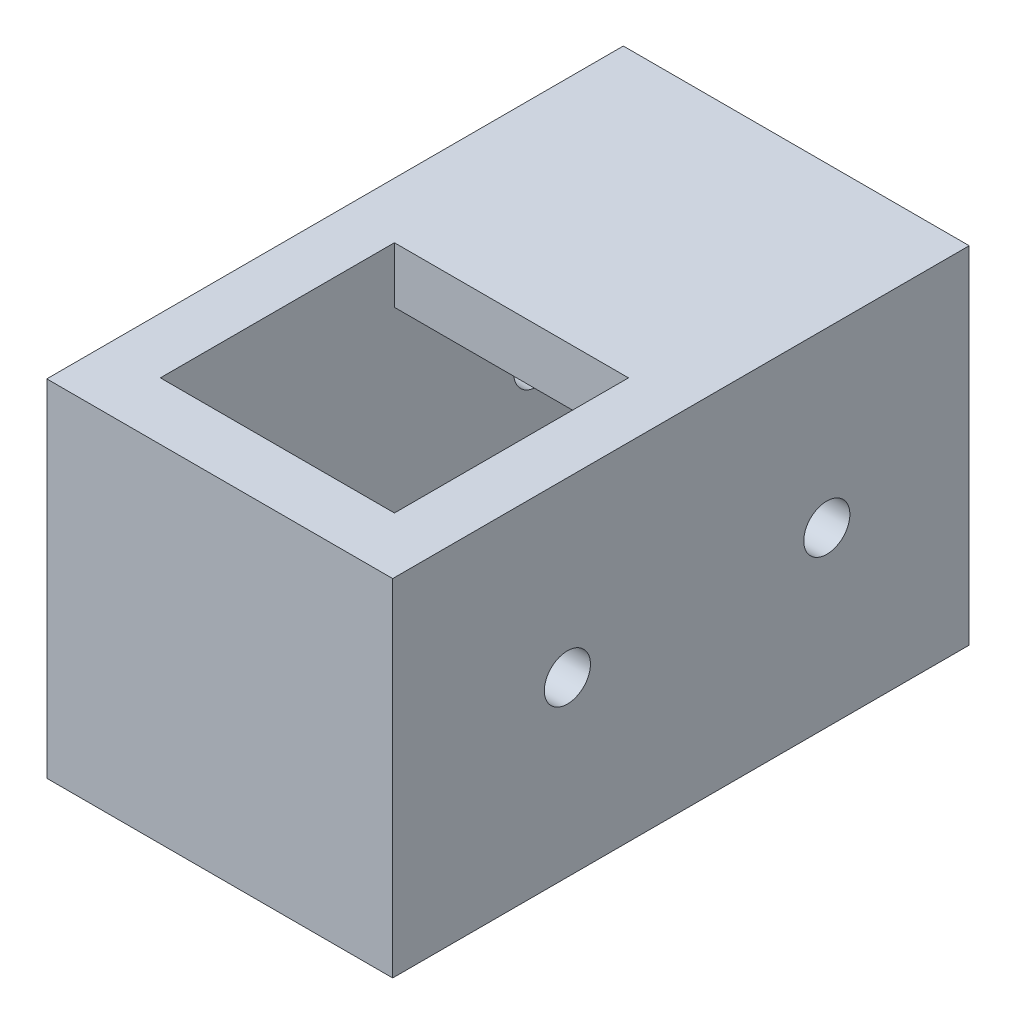
ISO-10303-21;
HEADER;
FILE_DESCRIPTION(('STEP AP214'),'2;1');
FILE_NAME('part.step','',(''),(''),'','','');
FILE_SCHEMA(('AUTOMOTIVE_DESIGN { 1 0 10303 214 1 1 1 1 }'));
ENDSEC;
DATA;
#1=APPLICATION_CONTEXT('core data for automotive mechanical design processes');
#2=APPLICATION_PROTOCOL_DEFINITION('international standard','automotive_design',2000,#1);
#3=PRODUCT_CONTEXT('',#1,'mechanical');
#4=PRODUCT('Part','Part','',(#3));
#5=PRODUCT_RELATED_PRODUCT_CATEGORY('part','',(#4));
#6=PRODUCT_DEFINITION_FORMATION('','',#4);
#7=PRODUCT_DEFINITION_CONTEXT('part definition',#1,'design');
#8=PRODUCT_DEFINITION('design','',#6,#7);
#9=PRODUCT_DEFINITION_SHAPE('','',#8);
#10=(LENGTH_UNIT() NAMED_UNIT(*) SI_UNIT(.MILLI.,.METRE.));
#11=(NAMED_UNIT(*) PLANE_ANGLE_UNIT() SI_UNIT($,.RADIAN.));
#12=(NAMED_UNIT(*) SI_UNIT($,.STERADIAN.) SOLID_ANGLE_UNIT());
#13=UNCERTAINTY_MEASURE_WITH_UNIT(LENGTH_MEASURE(1.E-05),#10,'distance_accuracy_value','');
#14=(GEOMETRIC_REPRESENTATION_CONTEXT(3) GLOBAL_UNCERTAINTY_ASSIGNED_CONTEXT((#13)) GLOBAL_UNIT_ASSIGNED_CONTEXT((#10,
#11,#12)) REPRESENTATION_CONTEXT('',''));
#15=CARTESIAN_POINT('',(0.,0.,0.));
#16=DIRECTION('',(0.,0.,1.));
#17=DIRECTION('',(1.,0.,0.));
#18=AXIS2_PLACEMENT_3D('',#15,#16,#17);
#19=CARTESIAN_POINT('',(0.,0.,0.));
#20=DIRECTION('',(0.,0.,-1.));
#21=DIRECTION('',(-1.,0.,0.));
#22=AXIS2_PLACEMENT_3D('',#19,#20,#21);
#23=PLANE('',#22);
#24=DIRECTION('',(0.,-1.,0.));
#25=VECTOR('',#24,1.);
#26=CARTESIAN_POINT('',(0.,0.,0.));
#27=LINE('',#26,#25);
#28=CARTESIAN_POINT('',(0.,30.,0.));
#29=VERTEX_POINT('',#28);
#30=CARTESIAN_POINT('',(0.,0.,0.));
#31=VERTEX_POINT('',#30);
#32=EDGE_CURVE('E216',#29,#31,#27,.T.);
#33=ORIENTED_EDGE('',*,*,#32,.F.);
#34=DIRECTION('',(-1.,0.,0.));
#35=VECTOR('',#34,1.);
#36=CARTESIAN_POINT('',(0.,30.,0.));
#37=LINE('',#36,#35);
#38=CARTESIAN_POINT('',(30.,30.,0.));
#39=VERTEX_POINT('',#38);
#40=EDGE_CURVE('E234',#39,#29,#37,.T.);
#41=ORIENTED_EDGE('',*,*,#40,.F.);
#42=DIRECTION('',(0.,1.,0.));
#43=VECTOR('',#42,1.);
#44=CARTESIAN_POINT('',(30.,0.,0.));
#45=LINE('',#44,#43);
#46=CARTESIAN_POINT('',(30.,0.,0.));
#47=VERTEX_POINT('',#46);
#48=EDGE_CURVE('E250',#47,#39,#45,.T.);
#49=ORIENTED_EDGE('',*,*,#48,.F.);
#50=DIRECTION('',(1.,0.,0.));
#51=VECTOR('',#50,1.);
#52=CARTESIAN_POINT('',(0.,0.,0.));
#53=LINE('',#52,#51);
#54=EDGE_CURVE('E247',#31,#47,#53,.T.);
#55=ORIENTED_EDGE('',*,*,#54,.F.);
#56=EDGE_LOOP('',(#33,#41,#49,#55));
#57=FACE_BOUND('',#56,.T.);
#58=DIRECTION('',(0.,-1.,0.));
#59=VECTOR('',#58,1.);
#60=CARTESIAN_POINT('',(25.15,25.15,0.));
#61=LINE('',#60,#59);
#62=CARTESIAN_POINT('',(25.15,25.15,0.));
#63=VERTEX_POINT('',#62);
#64=CARTESIAN_POINT('',(25.15,4.84999999999999,0.));
#65=VERTEX_POINT('',#64);
#66=EDGE_CURVE('E156',#63,#65,#61,.T.);
#67=ORIENTED_EDGE('',*,*,#66,.F.);
#68=DIRECTION('',(-1.,0.,0.));
#69=VECTOR('',#68,1.);
#70=CARTESIAN_POINT('',(25.15,25.15,0.));
#71=LINE('',#70,#69);
#72=CARTESIAN_POINT('',(4.85,25.15,0.));
#73=VERTEX_POINT('',#72);
#74=EDGE_CURVE('E62',#63,#73,#71,.T.);
#75=ORIENTED_EDGE('',*,*,#74,.T.);
#76=DIRECTION('',(0.,-1.,0.));
#77=VECTOR('',#76,1.);
#78=CARTESIAN_POINT('',(4.85,25.15,0.));
#79=LINE('',#78,#77);
#80=CARTESIAN_POINT('',(4.85,4.84999999999999,0.));
#81=VERTEX_POINT('',#80);
#82=EDGE_CURVE('E146',#73,#81,#79,.T.);
#83=ORIENTED_EDGE('',*,*,#82,.T.);
#84=DIRECTION('',(-1.,0.,0.));
#85=VECTOR('',#84,1.);
#86=CARTESIAN_POINT('',(25.15,4.84999999999999,0.));
#87=LINE('',#86,#85);
#88=EDGE_CURVE('E153',#65,#81,#87,.T.);
#89=ORIENTED_EDGE('',*,*,#88,.F.);
#90=EDGE_LOOP('',(#67,#75,#83,#89));
#91=FACE_BOUND('',#90,.T.);
#92=ADVANCED_FACE('F44',(#57,#91),#23,.T.);
#93=CARTESIAN_POINT('',(4.85,0.,24.7));
#94=DIRECTION('',(0.,0.,-1.));
#95=DIRECTION('',(-1.,0.,0.));
#96=AXIS2_PLACEMENT_3D('',#93,#94,#95);
#97=PLANE('',#96);
#98=DIRECTION('',(-1.,0.,0.));
#99=VECTOR('',#98,1.);
#100=CARTESIAN_POINT('',(4.85,25.15,24.7));
#101=LINE('',#100,#99);
#102=CARTESIAN_POINT('',(25.15,25.15,24.7));
#103=VERTEX_POINT('',#102);
#104=CARTESIAN_POINT('',(4.85,25.15,24.7));
#105=VERTEX_POINT('',#104);
#106=EDGE_CURVE('E138',#103,#105,#101,.T.);
#107=ORIENTED_EDGE('',*,*,#106,.F.);
#108=DIRECTION('',(0.,1.,0.));
#109=VECTOR('',#108,1.);
#110=CARTESIAN_POINT('',(25.15,0.,24.7));
#111=LINE('',#110,#109);
#112=CARTESIAN_POINT('',(25.15,30.,24.7));
#113=VERTEX_POINT('',#112);
#114=EDGE_CURVE('E222',#103,#113,#111,.T.);
#115=ORIENTED_EDGE('',*,*,#114,.T.);
#116=DIRECTION('',(-1.,0.,0.));
#117=VECTOR('',#116,1.);
#118=CARTESIAN_POINT('',(4.85,30.,24.7));
#119=LINE('',#118,#117);
#120=CARTESIAN_POINT('',(4.85,30.,24.7));
#121=VERTEX_POINT('',#120);
#122=EDGE_CURVE('E187',#113,#121,#119,.T.);
#123=ORIENTED_EDGE('',*,*,#122,.T.);
#124=DIRECTION('',(0.,1.,0.));
#125=VECTOR('',#124,1.);
#126=CARTESIAN_POINT('',(4.85,0.,24.7));
#127=LINE('',#126,#125);
#128=EDGE_CURVE('E217',#105,#121,#127,.T.);
#129=ORIENTED_EDGE('',*,*,#128,.F.);
#130=EDGE_LOOP('',(#107,#115,#123,#129));
#131=FACE_BOUND('',#130,.T.);
#132=ADVANCED_FACE('F315',(#131),#97,.F.);
#133=CARTESIAN_POINT('',(0.,0.,50.));
#134=DIRECTION('',(1.,0.,0.));
#135=DIRECTION('',(0.,0.,-1.));
#136=AXIS2_PLACEMENT_3D('',#133,#134,#135);
#137=PLANE('',#136);
#138=CARTESIAN_POINT('',(0.,15.,34.85));
#139=DIRECTION('',(-1.,0.,0.));
#140=DIRECTION('',(0.,0.,1.));
#141=AXIS2_PLACEMENT_3D('',#138,#139,#140);
#142=CIRCLE('',#141,2.);
#143=CARTESIAN_POINT('',(0.,15.,36.85));
#144=VERTEX_POINT('',#143);
#145=EDGE_CURVE('E275',#144,#144,#142,.T.);
#146=ORIENTED_EDGE('',*,*,#145,.F.);
#147=EDGE_LOOP('',(#146));
#148=FACE_BOUND('',#147,.T.);
#149=CARTESIAN_POINT('',(0.,15.,12.35));
#150=DIRECTION('',(-1.,0.,0.));
#151=DIRECTION('',(0.,0.,1.));
#152=AXIS2_PLACEMENT_3D('',#149,#150,#151);
#153=CIRCLE('',#152,2.);
#154=CARTESIAN_POINT('',(0.,15.,14.35));
#155=VERTEX_POINT('',#154);
#156=EDGE_CURVE('E281',#155,#155,#153,.T.);
#157=ORIENTED_EDGE('',*,*,#156,.F.);
#158=EDGE_LOOP('',(#157));
#159=FACE_BOUND('',#158,.T.);
#160=ORIENTED_EDGE('',*,*,#32,.T.);
#161=DIRECTION('',(0.,0.,-1.));
#162=VECTOR('',#161,1.);
#163=CARTESIAN_POINT('',(0.,0.,50.));
#164=LINE('',#163,#162);
#165=CARTESIAN_POINT('',(0.,0.,50.));
#166=VERTEX_POINT('',#165);
#167=EDGE_CURVE('E11',#166,#31,#164,.T.);
#168=ORIENTED_EDGE('',*,*,#167,.F.);
#169=DIRECTION('',(0.,-1.,0.));
#170=VECTOR('',#169,1.);
#171=CARTESIAN_POINT('',(0.,0.,50.));
#172=LINE('',#171,#170);
#173=CARTESIAN_POINT('',(0.,30.,50.));
#174=VERTEX_POINT('',#173);
#175=EDGE_CURVE('E229',#174,#166,#172,.T.);
#176=ORIENTED_EDGE('',*,*,#175,.F.);
#177=DIRECTION('',(0.,0.,-1.));
#178=VECTOR('',#177,1.);
#179=CARTESIAN_POINT('',(0.,30.,50.));
#180=LINE('',#179,#178);
#181=EDGE_CURVE('E243',#174,#29,#180,.T.);
#182=ORIENTED_EDGE('',*,*,#181,.T.);
#183=EDGE_LOOP('',(#160,#168,#176,#182));
#184=FACE_BOUND('',#183,.T.);
#185=ADVANCED_FACE('F46',(#148,#159,#184),#137,.F.);
#186=CARTESIAN_POINT('',(0.,0.,50.));
#187=DIRECTION('',(0.,1.,0.));
#188=DIRECTION('',(0.,0.,1.));
#189=AXIS2_PLACEMENT_3D('',#186,#187,#188);
#190=PLANE('',#189);
#191=DIRECTION('',(-1.,0.,0.));
#192=VECTOR('',#191,1.);
#193=CARTESIAN_POINT('',(4.85,0.,24.7));
#194=LINE('',#193,#192);
#195=CARTESIAN_POINT('',(25.15,0.,24.7));
#196=VERTEX_POINT('',#195);
#197=CARTESIAN_POINT('',(4.85,0.,24.7));
#198=VERTEX_POINT('',#197);
#199=EDGE_CURVE('E195',#196,#198,#194,.T.);
#200=ORIENTED_EDGE('',*,*,#199,.T.);
#201=DIRECTION('',(0.,0.,1.));
#202=VECTOR('',#201,1.);
#203=CARTESIAN_POINT('',(4.85,0.,24.7));
#204=LINE('',#203,#202);
#205=CARTESIAN_POINT('',(4.85,0.,45.));
#206=VERTEX_POINT('',#205);
#207=EDGE_CURVE('E182',#198,#206,#204,.T.);
#208=ORIENTED_EDGE('',*,*,#207,.T.);
#209=DIRECTION('',(1.,0.,0.));
#210=VECTOR('',#209,1.);
#211=CARTESIAN_POINT('',(4.85,0.,45.));
#212=LINE('',#211,#210);
#213=CARTESIAN_POINT('',(25.15,0.,45.));
#214=VERTEX_POINT('',#213);
#215=EDGE_CURVE('E186',#206,#214,#212,.T.);
#216=ORIENTED_EDGE('',*,*,#215,.T.);
#217=DIRECTION('',(0.,0.,-1.));
#218=VECTOR('',#217,1.);
#219=CARTESIAN_POINT('',(25.15,0.,24.7));
#220=LINE('',#219,#218);
#221=EDGE_CURVE('E191',#214,#196,#220,.T.);
#222=ORIENTED_EDGE('',*,*,#221,.T.);
#223=EDGE_LOOP('',(#200,#208,#216,#222));
#224=FACE_BOUND('',#223,.T.);
#225=ORIENTED_EDGE('',*,*,#54,.T.);
#226=DIRECTION('',(0.,0.,-1.));
#227=VECTOR('',#226,1.);
#228=CARTESIAN_POINT('',(30.,0.,50.));
#229=LINE('',#228,#227);
#230=CARTESIAN_POINT('',(30.,0.,50.));
#231=VERTEX_POINT('',#230);
#232=EDGE_CURVE('E54',#231,#47,#229,.T.);
#233=ORIENTED_EDGE('',*,*,#232,.F.);
#234=DIRECTION('',(1.,0.,0.));
#235=VECTOR('',#234,1.);
#236=CARTESIAN_POINT('',(0.,0.,50.));
#237=LINE('',#236,#235);
#238=EDGE_CURVE('E233',#166,#231,#237,.T.);
#239=ORIENTED_EDGE('',*,*,#238,.F.);
#240=ORIENTED_EDGE('',*,*,#167,.T.);
#241=EDGE_LOOP('',(#225,#233,#239,#240));
#242=FACE_BOUND('',#241,.T.);
#243=ADVANCED_FACE('F335',(#224,#242),#190,.F.);
#244=CARTESIAN_POINT('',(30.,0.,50.));
#245=DIRECTION('',(-1.,0.,0.));
#246=DIRECTION('',(0.,0.,1.));
#247=AXIS2_PLACEMENT_3D('',#244,#245,#246);
#248=PLANE('',#247);
#249=CARTESIAN_POINT('',(30.,15.,34.85));
#250=DIRECTION('',(-1.,0.,0.));
#251=DIRECTION('',(0.,0.,1.));
#252=AXIS2_PLACEMENT_3D('',#249,#250,#251);
#253=CIRCLE('',#252,2.);
#254=CARTESIAN_POINT('',(30.,15.,36.85));
#255=VERTEX_POINT('',#254);
#256=EDGE_CURVE('E268',#255,#255,#253,.T.);
#257=ORIENTED_EDGE('',*,*,#256,.T.);
#258=EDGE_LOOP('',(#257));
#259=FACE_BOUND('',#258,.T.);
#260=CARTESIAN_POINT('',(30.,15.,12.35));
#261=DIRECTION('',(-1.,0.,0.));
#262=DIRECTION('',(0.,0.,1.));
#263=AXIS2_PLACEMENT_3D('',#260,#261,#262);
#264=CIRCLE('',#263,2.);
#265=CARTESIAN_POINT('',(30.,15.,14.35));
#266=VERTEX_POINT('',#265);
#267=EDGE_CURVE('E287',#266,#266,#264,.T.);
#268=ORIENTED_EDGE('',*,*,#267,.T.);
#269=EDGE_LOOP('',(#268));
#270=FACE_BOUND('',#269,.T.);
#271=ORIENTED_EDGE('',*,*,#48,.T.);
#272=DIRECTION('',(0.,0.,-1.));
#273=VECTOR('',#272,1.);
#274=CARTESIAN_POINT('',(30.,30.,50.));
#275=LINE('',#274,#273);
#276=CARTESIAN_POINT('',(30.,30.,50.));
#277=VERTEX_POINT('',#276);
#278=EDGE_CURVE('E258',#277,#39,#275,.T.);
#279=ORIENTED_EDGE('',*,*,#278,.F.);
#280=DIRECTION('',(0.,1.,0.));
#281=VECTOR('',#280,1.);
#282=CARTESIAN_POINT('',(30.,0.,50.));
#283=LINE('',#282,#281);
#284=EDGE_CURVE('E237',#231,#277,#283,.T.);
#285=ORIENTED_EDGE('',*,*,#284,.F.);
#286=ORIENTED_EDGE('',*,*,#232,.T.);
#287=EDGE_LOOP('',(#271,#279,#285,#286));
#288=FACE_BOUND('',#287,.T.);
#289=ADVANCED_FACE('F292',(#259,#270,#288),#248,.F.);
#290=CARTESIAN_POINT('',(0.,30.,50.));
#291=DIRECTION('',(0.,-1.,0.));
#292=DIRECTION('',(0.,0.,-1.));
#293=AXIS2_PLACEMENT_3D('',#290,#291,#292);
#294=PLANE('',#293);
#295=DIRECTION('',(1.,0.,0.));
#296=VECTOR('',#295,1.);
#297=CARTESIAN_POINT('',(4.85,30.,45.));
#298=LINE('',#297,#296);
#299=CARTESIAN_POINT('',(4.85,30.,45.));
#300=VERTEX_POINT('',#299);
#301=CARTESIAN_POINT('',(25.15,30.,45.));
#302=VERTEX_POINT('',#301);
#303=EDGE_CURVE('E202',#300,#302,#298,.T.);
#304=ORIENTED_EDGE('',*,*,#303,.F.);
#305=DIRECTION('',(0.,0.,1.));
#306=VECTOR('',#305,1.);
#307=CARTESIAN_POINT('',(4.85,30.,24.7));
#308=LINE('',#307,#306);
#309=EDGE_CURVE('E181',#121,#300,#308,.T.);
#310=ORIENTED_EDGE('',*,*,#309,.F.);
#311=ORIENTED_EDGE('',*,*,#122,.F.);
#312=DIRECTION('',(0.,0.,-1.));
#313=VECTOR('',#312,1.);
#314=CARTESIAN_POINT('',(25.15,30.,24.7));
#315=LINE('',#314,#313);
#316=EDGE_CURVE('E206',#302,#113,#315,.T.);
#317=ORIENTED_EDGE('',*,*,#316,.F.);
#318=EDGE_LOOP('',(#304,#310,#311,#317));
#319=FACE_BOUND('',#318,.T.);
#320=ORIENTED_EDGE('',*,*,#40,.T.);
#321=ORIENTED_EDGE('',*,*,#181,.F.);
#322=DIRECTION('',(-1.,0.,0.));
#323=VECTOR('',#322,1.);
#324=CARTESIAN_POINT('',(0.,30.,50.));
#325=LINE('',#324,#323);
#326=EDGE_CURVE('E240',#277,#174,#325,.T.);
#327=ORIENTED_EDGE('',*,*,#326,.F.);
#328=ORIENTED_EDGE('',*,*,#278,.T.);
#329=EDGE_LOOP('',(#320,#321,#327,#328));
#330=FACE_BOUND('',#329,.T.);
#331=ADVANCED_FACE('F330',(#319,#330),#294,.F.);
#332=CARTESIAN_POINT('',(0.,0.,50.));
#333=DIRECTION('',(0.,0.,-1.));
#334=DIRECTION('',(-1.,0.,0.));
#335=AXIS2_PLACEMENT_3D('',#332,#333,#334);
#336=PLANE('',#335);
#337=ORIENTED_EDGE('',*,*,#175,.T.);
#338=ORIENTED_EDGE('',*,*,#238,.T.);
#339=ORIENTED_EDGE('',*,*,#284,.T.);
#340=ORIENTED_EDGE('',*,*,#326,.T.);
#341=EDGE_LOOP('',(#337,#338,#339,#340));
#342=FACE_BOUND('',#341,.T.);
#343=ADVANCED_FACE('F328',(#342),#336,.F.);
#344=CARTESIAN_POINT('',(4.85,0.,24.7));
#345=DIRECTION('',(-1.,0.,0.));
#346=DIRECTION('',(0.,0.,1.));
#347=AXIS2_PLACEMENT_3D('',#344,#345,#346);
#348=PLANE('',#347);
#349=CARTESIAN_POINT('',(4.84999999999999,15.,34.85));
#350=DIRECTION('',(-1.,0.,0.));
#351=DIRECTION('',(0.,0.,1.));
#352=AXIS2_PLACEMENT_3D('',#349,#350,#351);
#353=CIRCLE('',#352,2.);
#354=CARTESIAN_POINT('',(4.84999999999999,15.,36.85));
#355=VERTEX_POINT('',#354);
#356=EDGE_CURVE('E158',#355,#355,#353,.T.);
#357=ORIENTED_EDGE('',*,*,#356,.T.);
#358=EDGE_LOOP('',(#357));
#359=FACE_BOUND('',#358,.T.);
#360=CARTESIAN_POINT('',(4.84999999999999,15.,12.35));
#361=DIRECTION('',(-1.,0.,0.));
#362=DIRECTION('',(0.,0.,1.));
#363=AXIS2_PLACEMENT_3D('',#360,#361,#362);
#364=CIRCLE('',#363,2.);
#365=CARTESIAN_POINT('',(4.84999999999999,15.,14.35));
#366=VERTEX_POINT('',#365);
#367=EDGE_CURVE('E267',#366,#366,#364,.T.);
#368=ORIENTED_EDGE('',*,*,#367,.T.);
#369=EDGE_LOOP('',(#368));
#370=FACE_BOUND('',#369,.T.);
#371=CARTESIAN_POINT('',(4.85,4.84999999999999,24.7));
#372=VERTEX_POINT('',#371);
#373=EDGE_CURVE('E213',#198,#372,#127,.T.);
#374=ORIENTED_EDGE('',*,*,#373,.T.);
#375=DIRECTION('',(0.,0.,-1.));
#376=VECTOR('',#375,1.);
#377=CARTESIAN_POINT('',(4.85,4.84999999999999,30.));
#378=LINE('',#377,#376);
#379=EDGE_CURVE('E143',#372,#81,#378,.T.);
#380=ORIENTED_EDGE('',*,*,#379,.T.);
#381=ORIENTED_EDGE('',*,*,#82,.F.);
#382=DIRECTION('',(0.,0.,-1.));
#383=VECTOR('',#382,1.);
#384=CARTESIAN_POINT('',(4.85,25.15,30.));
#385=LINE('',#384,#383);
#386=EDGE_CURVE('E134',#105,#73,#385,.T.);
#387=ORIENTED_EDGE('',*,*,#386,.F.);
#388=ORIENTED_EDGE('',*,*,#128,.T.);
#389=ORIENTED_EDGE('',*,*,#309,.T.);
#390=DIRECTION('',(0.,1.,0.));
#391=VECTOR('',#390,1.);
#392=CARTESIAN_POINT('',(4.85,0.,45.));
#393=LINE('',#392,#391);
#394=EDGE_CURVE('E199',#206,#300,#393,.T.);
#395=ORIENTED_EDGE('',*,*,#394,.F.);
#396=ORIENTED_EDGE('',*,*,#207,.F.);
#397=EDGE_LOOP('',(#374,#380,#381,#387,#388,#389,#395,#396));
#398=FACE_BOUND('',#397,.T.);
#399=ADVANCED_FACE('F148',(#359,#370,#398),#348,.F.);
#400=CARTESIAN_POINT('',(25.15,4.84999999999999,24.7));
#401=VERTEX_POINT('',#400);
#402=EDGE_CURVE('E218',#196,#401,#111,.T.);
#403=ORIENTED_EDGE('',*,*,#402,.T.);
#404=DIRECTION('',(-1.,0.,0.));
#405=VECTOR('',#404,1.);
#406=CARTESIAN_POINT('',(4.85,4.84999999999999,24.7));
#407=LINE('',#406,#405);
#408=EDGE_CURVE('E142',#401,#372,#407,.T.);
#409=ORIENTED_EDGE('',*,*,#408,.T.);
#410=ORIENTED_EDGE('',*,*,#373,.F.);
#411=ORIENTED_EDGE('',*,*,#199,.F.);
#412=EDGE_LOOP('',(#403,#409,#410,#411));
#413=FACE_BOUND('',#412,.T.);
#414=ADVANCED_FACE('F324',(#413),#97,.F.);
#415=CARTESIAN_POINT('',(25.15,0.,24.7));
#416=DIRECTION('',(1.,0.,0.));
#417=DIRECTION('',(0.,0.,-1.));
#418=AXIS2_PLACEMENT_3D('',#415,#416,#417);
#419=PLANE('',#418);
#420=CARTESIAN_POINT('',(25.15,15.,34.85));
#421=DIRECTION('',(1.,0.,0.));
#422=DIRECTION('',(0.,0.,-1.));
#423=AXIS2_PLACEMENT_3D('',#420,#421,#422);
#424=CIRCLE('',#423,2.);
#425=CARTESIAN_POINT('',(25.15,15.,32.85));
#426=VERTEX_POINT('',#425);
#427=EDGE_CURVE('E48',#426,#426,#424,.T.);
#428=ORIENTED_EDGE('',*,*,#427,.T.);
#429=EDGE_LOOP('',(#428));
#430=FACE_BOUND('',#429,.T.);
#431=CARTESIAN_POINT('',(25.15,15.,12.35));
#432=DIRECTION('',(1.,0.,0.));
#433=DIRECTION('',(0.,0.,-1.));
#434=AXIS2_PLACEMENT_3D('',#431,#432,#433);
#435=CIRCLE('',#434,2.);
#436=CARTESIAN_POINT('',(25.15,15.,10.35));
#437=VERTEX_POINT('',#436);
#438=EDGE_CURVE('E264',#437,#437,#435,.T.);
#439=ORIENTED_EDGE('',*,*,#438,.T.);
#440=EDGE_LOOP('',(#439));
#441=FACE_BOUND('',#440,.T.);
#442=ORIENTED_EDGE('',*,*,#114,.F.);
#443=DIRECTION('',(0.,0.,-1.));
#444=VECTOR('',#443,1.);
#445=CARTESIAN_POINT('',(25.15,25.15,30.));
#446=LINE('',#445,#444);
#447=EDGE_CURVE('E169',#103,#63,#446,.T.);
#448=ORIENTED_EDGE('',*,*,#447,.T.);
#449=ORIENTED_EDGE('',*,*,#66,.T.);
#450=DIRECTION('',(0.,0.,-1.));
#451=VECTOR('',#450,1.);
#452=CARTESIAN_POINT('',(25.15,4.84999999999999,30.));
#453=LINE('',#452,#451);
#454=EDGE_CURVE('E70',#401,#65,#453,.T.);
#455=ORIENTED_EDGE('',*,*,#454,.F.);
#456=ORIENTED_EDGE('',*,*,#402,.F.);
#457=ORIENTED_EDGE('',*,*,#221,.F.);
#458=DIRECTION('',(0.,1.,0.));
#459=VECTOR('',#458,1.);
#460=CARTESIAN_POINT('',(25.15,0.,45.));
#461=LINE('',#460,#459);
#462=EDGE_CURVE('E223',#214,#302,#461,.T.);
#463=ORIENTED_EDGE('',*,*,#462,.T.);
#464=ORIENTED_EDGE('',*,*,#316,.T.);
#465=EDGE_LOOP('',(#442,#448,#449,#455,#456,#457,#463,#464));
#466=FACE_BOUND('',#465,.T.);
#467=ADVANCED_FACE('F364',(#430,#441,#466),#419,.F.);
#468=CARTESIAN_POINT('',(4.85,0.,45.));
#469=DIRECTION('',(0.,0.,1.));
#470=DIRECTION('',(1.,0.,0.));
#471=AXIS2_PLACEMENT_3D('',#468,#469,#470);
#472=PLANE('',#471);
#473=ORIENTED_EDGE('',*,*,#303,.T.);
#474=ORIENTED_EDGE('',*,*,#462,.F.);
#475=ORIENTED_EDGE('',*,*,#215,.F.);
#476=ORIENTED_EDGE('',*,*,#394,.T.);
#477=EDGE_LOOP('',(#473,#474,#475,#476));
#478=FACE_BOUND('',#477,.T.);
#479=ADVANCED_FACE('F368',(#478),#472,.F.);
#480=CARTESIAN_POINT('',(25.15,25.15,30.));
#481=DIRECTION('',(0.,-1.,0.));
#482=DIRECTION('',(0.,0.,-1.));
#483=AXIS2_PLACEMENT_3D('',#480,#481,#482);
#484=PLANE('',#483);
#485=ORIENTED_EDGE('',*,*,#106,.T.);
#486=ORIENTED_EDGE('',*,*,#386,.T.);
#487=ORIENTED_EDGE('',*,*,#74,.F.);
#488=ORIENTED_EDGE('',*,*,#447,.F.);
#489=EDGE_LOOP('',(#485,#486,#487,#488));
#490=FACE_BOUND('',#489,.T.);
#491=ADVANCED_FACE('F136',(#490),#484,.T.);
#492=CARTESIAN_POINT('',(25.15,4.84999999999999,30.));
#493=DIRECTION('',(0.,-1.,0.));
#494=DIRECTION('',(1.,0.,0.));
#495=AXIS2_PLACEMENT_3D('',#492,#493,#494);
#496=PLANE('',#495);
#497=ORIENTED_EDGE('',*,*,#454,.T.);
#498=ORIENTED_EDGE('',*,*,#88,.T.);
#499=ORIENTED_EDGE('',*,*,#379,.F.);
#500=ORIENTED_EDGE('',*,*,#408,.F.);
#501=EDGE_LOOP('',(#497,#498,#499,#500));
#502=FACE_BOUND('',#501,.T.);
#503=ADVANCED_FACE('F299',(#502),#496,.F.);
#504=CARTESIAN_POINT('',(30.,15.,12.35));
#505=DIRECTION('',(-1.,0.,0.));
#506=DIRECTION('',(0.,0.,1.));
#507=AXIS2_PLACEMENT_3D('',#504,#505,#506);
#508=CYLINDRICAL_SURFACE('',#507,2.);
#509=ORIENTED_EDGE('',*,*,#267,.F.);
#510=EDGE_LOOP('',(#509));
#511=FACE_BOUND('',#510,.T.);
#512=ORIENTED_EDGE('',*,*,#438,.F.);
#513=EDGE_LOOP('',(#512));
#514=FACE_BOUND('',#513,.T.);
#515=ADVANCED_FACE('F295',(#511,#514),#508,.F.);
#516=CARTESIAN_POINT('',(30.,15.,34.85));
#517=DIRECTION('',(-1.,0.,0.));
#518=DIRECTION('',(0.,0.,1.));
#519=AXIS2_PLACEMENT_3D('',#516,#517,#518);
#520=CYLINDRICAL_SURFACE('',#519,2.);
#521=ORIENTED_EDGE('',*,*,#256,.F.);
#522=EDGE_LOOP('',(#521));
#523=FACE_BOUND('',#522,.T.);
#524=ORIENTED_EDGE('',*,*,#427,.F.);
#525=EDGE_LOOP('',(#524));
#526=FACE_BOUND('',#525,.T.);
#527=ADVANCED_FACE('F298',(#523,#526),#520,.F.);
#528=ORIENTED_EDGE('',*,*,#156,.T.);
#529=EDGE_LOOP('',(#528));
#530=FACE_BOUND('',#529,.T.);
#531=ORIENTED_EDGE('',*,*,#367,.F.);
#532=EDGE_LOOP('',(#531));
#533=FACE_BOUND('',#532,.T.);
#534=ADVANCED_FACE('F301',(#530,#533),#508,.F.);
#535=ORIENTED_EDGE('',*,*,#145,.T.);
#536=EDGE_LOOP('',(#535));
#537=FACE_BOUND('',#536,.T.);
#538=ORIENTED_EDGE('',*,*,#356,.F.);
#539=EDGE_LOOP('',(#538));
#540=FACE_BOUND('',#539,.T.);
#541=ADVANCED_FACE('F308',(#537,#540),#520,.F.);
#542=CLOSED_SHELL('',(#92,#132,#185,#243,#289,#331,#343,#399,#414,#467,#479,#491,#503,#515,#527,
#534,#541));
#543=MANIFOLD_SOLID_BREP('B2',#542);
#544=ADVANCED_BREP_SHAPE_REPRESENTATION('',(#18,#543),#14);
#545=SHAPE_DEFINITION_REPRESENTATION(#9,#544);
ENDSEC;
END-ISO-10303-21;
